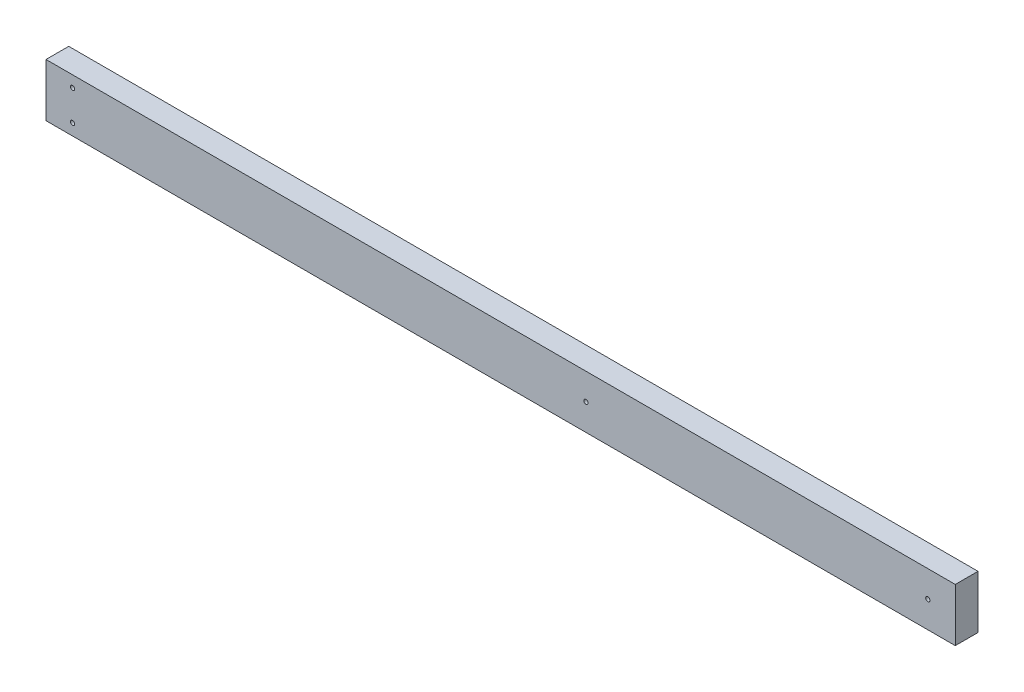
ISO-10303-21;
HEADER;
FILE_DESCRIPTION(('STEP AP214'),'2;1');
FILE_NAME('part.step','',(''),(''),'','','');
FILE_SCHEMA(('AUTOMOTIVE_DESIGN { 1 0 10303 214 1 1 1 1 }'));
ENDSEC;
DATA;
#1=APPLICATION_CONTEXT('core data for automotive mechanical design processes');
#2=APPLICATION_PROTOCOL_DEFINITION('international standard','automotive_design',2000,#1);
#3=PRODUCT_CONTEXT('',#1,'mechanical');
#4=PRODUCT('Part','Part','',(#3));
#5=PRODUCT_RELATED_PRODUCT_CATEGORY('part','',(#4));
#6=PRODUCT_DEFINITION_FORMATION('','',#4);
#7=PRODUCT_DEFINITION_CONTEXT('part definition',#1,'design');
#8=PRODUCT_DEFINITION('design','',#6,#7);
#9=PRODUCT_DEFINITION_SHAPE('','',#8);
#10=(LENGTH_UNIT() NAMED_UNIT(*) SI_UNIT(.MILLI.,.METRE.));
#11=(NAMED_UNIT(*) PLANE_ANGLE_UNIT() SI_UNIT($,.RADIAN.));
#12=(NAMED_UNIT(*) SI_UNIT($,.STERADIAN.) SOLID_ANGLE_UNIT());
#13=UNCERTAINTY_MEASURE_WITH_UNIT(LENGTH_MEASURE(1.E-05),#10,'distance_accuracy_value','');
#14=(GEOMETRIC_REPRESENTATION_CONTEXT(3) GLOBAL_UNCERTAINTY_ASSIGNED_CONTEXT((#13)) GLOBAL_UNIT_ASSIGNED_CONTEXT((#10,
#11,#12)) REPRESENTATION_CONTEXT('',''));
#15=CARTESIAN_POINT('',(0.,0.,0.));
#16=DIRECTION('',(0.,0.,1.));
#17=DIRECTION('',(1.,0.,0.));
#18=AXIS2_PLACEMENT_3D('',#15,#16,#17);
#19=CARTESIAN_POINT('',(1524.,0.,0.));
#20=DIRECTION('',(0.,0.,-1.));
#21=DIRECTION('',(-1.,0.,0.));
#22=AXIS2_PLACEMENT_3D('',#19,#20,#21);
#23=PLANE('',#22);
#24=CARTESIAN_POINT('',(44.45,19.05,0.));
#25=DIRECTION('',(0.,0.,1.));
#26=DIRECTION('',(1.,0.,0.));
#27=AXIS2_PLACEMENT_3D('',#24,#25,#26);
#28=CIRCLE('',#27,3.57187499999996);
#29=CARTESIAN_POINT('',(48.021875,19.05,0.));
#30=VERTEX_POINT('',#29);
#31=EDGE_CURVE('E122',#30,#30,#28,.T.);
#32=ORIENTED_EDGE('',*,*,#31,.F.);
#33=EDGE_LOOP('',(#32));
#34=FACE_BOUND('',#33,.T.);
#35=CARTESIAN_POINT('',(904.875,44.45,0.));
#36=DIRECTION('',(0.,0.,1.));
#37=DIRECTION('',(1.,0.,0.));
#38=AXIS2_PLACEMENT_3D('',#35,#36,#37);
#39=CIRCLE('',#38,3.57187499999998);
#40=CARTESIAN_POINT('',(908.446875,44.45,0.));
#41=VERTEX_POINT('',#40);
#42=EDGE_CURVE('E123',#41,#41,#39,.T.);
#43=ORIENTED_EDGE('',*,*,#42,.F.);
#44=EDGE_LOOP('',(#43));
#45=FACE_BOUND('',#44,.T.);
#46=CARTESIAN_POINT('',(44.45,69.85,0.));
#47=DIRECTION('',(0.,0.,1.));
#48=DIRECTION('',(1.,0.,0.));
#49=AXIS2_PLACEMENT_3D('',#46,#47,#48);
#50=CIRCLE('',#49,3.571875);
#51=CARTESIAN_POINT('',(48.021875,69.85,0.));
#52=VERTEX_POINT('',#51);
#53=EDGE_CURVE('E109',#52,#52,#50,.T.);
#54=ORIENTED_EDGE('',*,*,#53,.F.);
#55=EDGE_LOOP('',(#54));
#56=FACE_BOUND('',#55,.T.);
#57=CARTESIAN_POINT('',(1477.9625,44.45,0.));
#58=DIRECTION('',(0.,0.,1.));
#59=DIRECTION('',(1.,0.,0.));
#60=AXIS2_PLACEMENT_3D('',#57,#58,#59);
#61=CIRCLE('',#60,3.57187499999998);
#62=CARTESIAN_POINT('',(1481.534375,44.45,0.));
#63=VERTEX_POINT('',#62);
#64=EDGE_CURVE('E116',#63,#63,#61,.T.);
#65=ORIENTED_EDGE('',*,*,#64,.F.);
#66=EDGE_LOOP('',(#65));
#67=FACE_BOUND('',#66,.T.);
#68=DIRECTION('',(0.,-1.,0.));
#69=VECTOR('',#68,1.);
#70=CARTESIAN_POINT('',(0.,0.,0.));
#71=LINE('',#70,#69);
#72=CARTESIAN_POINT('',(0.,88.9,0.));
#73=VERTEX_POINT('',#72);
#74=CARTESIAN_POINT('',(0.,0.,0.));
#75=VERTEX_POINT('',#74);
#76=EDGE_CURVE('E95',#73,#75,#71,.T.);
#77=ORIENTED_EDGE('',*,*,#76,.T.);
#78=DIRECTION('',(-1.,0.,0.));
#79=VECTOR('',#78,1.);
#80=CARTESIAN_POINT('',(1524.,0.,0.));
#81=LINE('',#80,#79);
#82=CARTESIAN_POINT('',(1524.,0.,0.));
#83=VERTEX_POINT('',#82);
#84=EDGE_CURVE('E11',#83,#75,#81,.T.);
#85=ORIENTED_EDGE('',*,*,#84,.F.);
#86=DIRECTION('',(0.,-1.,0.));
#87=VECTOR('',#86,1.);
#88=CARTESIAN_POINT('',(1524.,0.,0.));
#89=LINE('',#88,#87);
#90=CARTESIAN_POINT('',(1524.,88.9,0.));
#91=VERTEX_POINT('',#90);
#92=EDGE_CURVE('E83',#91,#83,#89,.T.);
#93=ORIENTED_EDGE('',*,*,#92,.F.);
#94=DIRECTION('',(-1.,0.,0.));
#95=VECTOR('',#94,1.);
#96=CARTESIAN_POINT('',(1524.,88.9,0.));
#97=LINE('',#96,#95);
#98=EDGE_CURVE('E91',#91,#73,#97,.T.);
#99=ORIENTED_EDGE('',*,*,#98,.T.);
#100=EDGE_LOOP('',(#77,#85,#93,#99));
#101=FACE_BOUND('',#100,.T.);
#102=ADVANCED_FACE('F32',(#34,#45,#56,#67,#101),#23,.F.);
#103=CARTESIAN_POINT('',(1524.,0.,0.));
#104=DIRECTION('',(0.,1.,0.));
#105=DIRECTION('',(0.,0.,1.));
#106=AXIS2_PLACEMENT_3D('',#103,#104,#105);
#107=PLANE('',#106);
#108=DIRECTION('',(0.,0.,-1.));
#109=VECTOR('',#108,1.);
#110=CARTESIAN_POINT('',(0.,0.,0.));
#111=LINE('',#110,#109);
#112=CARTESIAN_POINT('',(0.,0.,-38.1));
#113=VERTEX_POINT('',#112);
#114=EDGE_CURVE('E87',#75,#113,#111,.T.);
#115=ORIENTED_EDGE('',*,*,#114,.T.);
#116=DIRECTION('',(-1.,0.,0.));
#117=VECTOR('',#116,1.);
#118=CARTESIAN_POINT('',(1524.,0.,-38.1));
#119=LINE('',#118,#117);
#120=CARTESIAN_POINT('',(1524.,0.,-38.1));
#121=VERTEX_POINT('',#120);
#122=EDGE_CURVE('E40',#121,#113,#119,.T.);
#123=ORIENTED_EDGE('',*,*,#122,.F.);
#124=DIRECTION('',(0.,0.,-1.));
#125=VECTOR('',#124,1.);
#126=CARTESIAN_POINT('',(1524.,0.,0.));
#127=LINE('',#126,#125);
#128=EDGE_CURVE('E78',#83,#121,#127,.T.);
#129=ORIENTED_EDGE('',*,*,#128,.F.);
#130=ORIENTED_EDGE('',*,*,#84,.T.);
#131=EDGE_LOOP('',(#115,#123,#129,#130));
#132=FACE_BOUND('',#131,.T.);
#133=ADVANCED_FACE('F86',(#132),#107,.F.);
#134=CARTESIAN_POINT('',(1524.,0.,-38.1));
#135=DIRECTION('',(0.,0.,1.));
#136=DIRECTION('',(1.,0.,0.));
#137=AXIS2_PLACEMENT_3D('',#134,#135,#136);
#138=PLANE('',#137);
#139=CARTESIAN_POINT('',(44.45,19.05,-38.1));
#140=DIRECTION('',(0.,0.,1.));
#141=DIRECTION('',(1.,0.,0.));
#142=AXIS2_PLACEMENT_3D('',#139,#140,#141);
#143=CIRCLE('',#142,3.57187499999996);
#144=CARTESIAN_POINT('',(48.021875,19.05,-38.1));
#145=VERTEX_POINT('',#144);
#146=EDGE_CURVE('E98',#145,#145,#143,.T.);
#147=ORIENTED_EDGE('',*,*,#146,.T.);
#148=EDGE_LOOP('',(#147));
#149=FACE_BOUND('',#148,.T.);
#150=CARTESIAN_POINT('',(904.875,44.45,-38.1));
#151=DIRECTION('',(0.,0.,1.));
#152=DIRECTION('',(1.,0.,0.));
#153=AXIS2_PLACEMENT_3D('',#150,#151,#152);
#154=CIRCLE('',#153,3.57187499999998);
#155=CARTESIAN_POINT('',(908.446875,44.45,-38.1));
#156=VERTEX_POINT('',#155);
#157=EDGE_CURVE('E113',#156,#156,#154,.T.);
#158=ORIENTED_EDGE('',*,*,#157,.T.);
#159=EDGE_LOOP('',(#158));
#160=FACE_BOUND('',#159,.T.);
#161=CARTESIAN_POINT('',(44.45,69.85,-38.1));
#162=DIRECTION('',(0.,0.,1.));
#163=DIRECTION('',(1.,0.,0.));
#164=AXIS2_PLACEMENT_3D('',#161,#162,#163);
#165=CIRCLE('',#164,3.571875);
#166=CARTESIAN_POINT('',(48.021875,69.85,-38.1));
#167=VERTEX_POINT('',#166);
#168=EDGE_CURVE('E112',#167,#167,#165,.T.);
#169=ORIENTED_EDGE('',*,*,#168,.T.);
#170=EDGE_LOOP('',(#169));
#171=FACE_BOUND('',#170,.T.);
#172=CARTESIAN_POINT('',(1477.9625,44.45,-38.1));
#173=DIRECTION('',(0.,0.,1.));
#174=DIRECTION('',(1.,0.,0.));
#175=AXIS2_PLACEMENT_3D('',#172,#173,#174);
#176=CIRCLE('',#175,3.57187499999998);
#177=CARTESIAN_POINT('',(1481.534375,44.45,-38.1));
#178=VERTEX_POINT('',#177);
#179=EDGE_CURVE('E119',#178,#178,#176,.T.);
#180=ORIENTED_EDGE('',*,*,#179,.T.);
#181=EDGE_LOOP('',(#180));
#182=FACE_BOUND('',#181,.T.);
#183=DIRECTION('',(0.,1.,0.));
#184=VECTOR('',#183,1.);
#185=CARTESIAN_POINT('',(0.,0.,-38.1));
#186=LINE('',#185,#184);
#187=CARTESIAN_POINT('',(0.,88.9,-38.1));
#188=VERTEX_POINT('',#187);
#189=EDGE_CURVE('E65',#113,#188,#186,.T.);
#190=ORIENTED_EDGE('',*,*,#189,.T.);
#191=DIRECTION('',(-1.,0.,0.));
#192=VECTOR('',#191,1.);
#193=CARTESIAN_POINT('',(1524.,88.9,-38.1));
#194=LINE('',#193,#192);
#195=CARTESIAN_POINT('',(1524.,88.9,-38.1));
#196=VERTEX_POINT('',#195);
#197=EDGE_CURVE('E88',#196,#188,#194,.T.);
#198=ORIENTED_EDGE('',*,*,#197,.F.);
#199=DIRECTION('',(0.,1.,0.));
#200=VECTOR('',#199,1.);
#201=CARTESIAN_POINT('',(1524.,0.,-38.1));
#202=LINE('',#201,#200);
#203=EDGE_CURVE('E81',#121,#196,#202,.T.);
#204=ORIENTED_EDGE('',*,*,#203,.F.);
#205=ORIENTED_EDGE('',*,*,#122,.T.);
#206=EDGE_LOOP('',(#190,#198,#204,#205));
#207=FACE_BOUND('',#206,.T.);
#208=ADVANCED_FACE('F89',(#149,#160,#171,#182,#207),#138,.F.);
#209=CARTESIAN_POINT('',(1524.,88.9,0.));
#210=DIRECTION('',(0.,-1.,0.));
#211=DIRECTION('',(0.,0.,-1.));
#212=AXIS2_PLACEMENT_3D('',#209,#210,#211);
#213=PLANE('',#212);
#214=DIRECTION('',(0.,0.,1.));
#215=VECTOR('',#214,1.);
#216=CARTESIAN_POINT('',(0.,88.9,0.));
#217=LINE('',#216,#215);
#218=EDGE_CURVE('E71',#188,#73,#217,.T.);
#219=ORIENTED_EDGE('',*,*,#218,.T.);
#220=ORIENTED_EDGE('',*,*,#98,.F.);
#221=DIRECTION('',(0.,0.,1.));
#222=VECTOR('',#221,1.);
#223=CARTESIAN_POINT('',(1524.,88.9,0.));
#224=LINE('',#223,#222);
#225=EDGE_CURVE('E48',#196,#91,#224,.T.);
#226=ORIENTED_EDGE('',*,*,#225,.F.);
#227=ORIENTED_EDGE('',*,*,#197,.T.);
#228=EDGE_LOOP('',(#219,#220,#226,#227));
#229=FACE_BOUND('',#228,.T.);
#230=ADVANCED_FACE('F103',(#229),#213,.F.);
#231=CARTESIAN_POINT('',(1524.,0.,0.));
#232=DIRECTION('',(-1.,0.,0.));
#233=DIRECTION('',(0.,0.,1.));
#234=AXIS2_PLACEMENT_3D('',#231,#232,#233);
#235=PLANE('',#234);
#236=ORIENTED_EDGE('',*,*,#92,.T.);
#237=ORIENTED_EDGE('',*,*,#128,.T.);
#238=ORIENTED_EDGE('',*,*,#203,.T.);
#239=ORIENTED_EDGE('',*,*,#225,.T.);
#240=EDGE_LOOP('',(#236,#237,#238,#239));
#241=FACE_BOUND('',#240,.T.);
#242=ADVANCED_FACE('F79',(#241),#235,.F.);
#243=CARTESIAN_POINT('',(0.,0.,0.));
#244=DIRECTION('',(-1.,0.,0.));
#245=DIRECTION('',(0.,0.,1.));
#246=AXIS2_PLACEMENT_3D('',#243,#244,#245);
#247=PLANE('',#246);
#248=ORIENTED_EDGE('',*,*,#76,.F.);
#249=ORIENTED_EDGE('',*,*,#218,.F.);
#250=ORIENTED_EDGE('',*,*,#189,.F.);
#251=ORIENTED_EDGE('',*,*,#114,.F.);
#252=EDGE_LOOP('',(#248,#249,#250,#251));
#253=FACE_BOUND('',#252,.T.);
#254=ADVANCED_FACE('F106',(#253),#247,.T.);
#255=CARTESIAN_POINT('',(1477.9625,44.45,-38.1));
#256=DIRECTION('',(0.,0.,1.));
#257=DIRECTION('',(1.,0.,0.));
#258=AXIS2_PLACEMENT_3D('',#255,#256,#257);
#259=CYLINDRICAL_SURFACE('',#258,3.57187499999998);
#260=CARTESIAN_POINT('',(1481.534375,44.45,-38.1));
#261=CARTESIAN_POINT('',(1481.534375,44.45,-37.703125));
#262=CARTESIAN_POINT('',(1481.534375,44.45,-37.30625));
#263=CARTESIAN_POINT('',(1481.534375,44.45,-36.5125));
#264=CARTESIAN_POINT('',(1481.534375,44.45,-36.115625));
#265=CARTESIAN_POINT('',(1481.534375,44.45,-35.321875));
#266=CARTESIAN_POINT('',(1481.534375,44.45,-34.925));
#267=CARTESIAN_POINT('',(1481.534375,44.45,-34.13125));
#268=CARTESIAN_POINT('',(1481.534375,44.45,-33.734375));
#269=CARTESIAN_POINT('',(1481.534375,44.45,-32.940625));
#270=CARTESIAN_POINT('',(1481.534375,44.45,-32.54375));
#271=CARTESIAN_POINT('',(1481.534375,44.45,-31.75));
#272=CARTESIAN_POINT('',(1481.534375,44.45,-31.353125));
#273=CARTESIAN_POINT('',(1481.534375,44.45,-30.559375));
#274=CARTESIAN_POINT('',(1481.534375,44.45,-30.1625));
#275=CARTESIAN_POINT('',(1481.534375,44.45,-29.36875));
#276=CARTESIAN_POINT('',(1481.534375,44.45,-28.971875));
#277=CARTESIAN_POINT('',(1481.534375,44.45,-28.178125));
#278=CARTESIAN_POINT('',(1481.534375,44.45,-27.78125));
#279=CARTESIAN_POINT('',(1481.534375,44.45,-26.9875));
#280=CARTESIAN_POINT('',(1481.534375,44.45,-26.590625));
#281=CARTESIAN_POINT('',(1481.534375,44.45,-25.796875));
#282=CARTESIAN_POINT('',(1481.534375,44.45,-25.4));
#283=CARTESIAN_POINT('',(1481.534375,44.45,-24.60625));
#284=CARTESIAN_POINT('',(1481.534375,44.45,-24.209375));
#285=CARTESIAN_POINT('',(1481.534375,44.45,-23.415625));
#286=CARTESIAN_POINT('',(1481.534375,44.45,-23.01875));
#287=CARTESIAN_POINT('',(1481.534375,44.45,-22.225));
#288=CARTESIAN_POINT('',(1481.534375,44.45,-21.828125));
#289=CARTESIAN_POINT('',(1481.534375,44.45,-21.034375));
#290=CARTESIAN_POINT('',(1481.534375,44.45,-20.6375));
#291=CARTESIAN_POINT('',(1481.534375,44.45,-19.84375));
#292=CARTESIAN_POINT('',(1481.534375,44.45,-19.446875));
#293=CARTESIAN_POINT('',(1481.534375,44.45,-18.653125));
#294=CARTESIAN_POINT('',(1481.534375,44.45,-18.25625));
#295=CARTESIAN_POINT('',(1481.534375,44.45,-17.4625));
#296=CARTESIAN_POINT('',(1481.534375,44.45,-17.065625));
#297=CARTESIAN_POINT('',(1481.534375,44.45,-16.271875));
#298=CARTESIAN_POINT('',(1481.534375,44.45,-15.875));
#299=CARTESIAN_POINT('',(1481.534375,44.45,-15.08125));
#300=CARTESIAN_POINT('',(1481.534375,44.45,-14.684375));
#301=CARTESIAN_POINT('',(1481.534375,44.45,-13.890625));
#302=CARTESIAN_POINT('',(1481.534375,44.45,-13.49375));
#303=CARTESIAN_POINT('',(1481.534375,44.45,-12.7));
#304=CARTESIAN_POINT('',(1481.534375,44.45,-12.303125));
#305=CARTESIAN_POINT('',(1481.534375,44.45,-11.509375));
#306=CARTESIAN_POINT('',(1481.534375,44.45,-11.1125));
#307=CARTESIAN_POINT('',(1481.534375,44.45,-10.31875));
#308=CARTESIAN_POINT('',(1481.534375,44.45,-9.921875));
#309=CARTESIAN_POINT('',(1481.534375,44.45,-9.128125));
#310=CARTESIAN_POINT('',(1481.534375,44.45,-8.73125));
#311=CARTESIAN_POINT('',(1481.534375,44.45,-7.9375));
#312=CARTESIAN_POINT('',(1481.534375,44.45,-7.540625));
#313=CARTESIAN_POINT('',(1481.534375,44.45,-6.746875));
#314=CARTESIAN_POINT('',(1481.534375,44.45,-6.35));
#315=CARTESIAN_POINT('',(1481.534375,44.45,-5.55625));
#316=CARTESIAN_POINT('',(1481.534375,44.45,-5.159375));
#317=CARTESIAN_POINT('',(1481.534375,44.45,-4.365625));
#318=CARTESIAN_POINT('',(1481.534375,44.45,-3.96875));
#319=CARTESIAN_POINT('',(1481.534375,44.45,-3.175));
#320=CARTESIAN_POINT('',(1481.534375,44.45,-2.778125));
#321=CARTESIAN_POINT('',(1481.534375,44.45,-1.984375));
#322=CARTESIAN_POINT('',(1481.534375,44.45,-1.5875));
#323=CARTESIAN_POINT('',(1481.534375,44.45,-0.79375));
#324=CARTESIAN_POINT('',(1481.534375,44.45,-0.396875));
#325=CARTESIAN_POINT('',(1481.534375,44.45,0.));
#326=B_SPLINE_CURVE_WITH_KNOTS('',3,(#260,#261,#262,#263,#264,#265,#266,#267,#268,#269,#270,
#271,#272,#273,#274,#275,#276,#277,#278,#279,#280,#281,#282,#283,#284,#285,#286,#287,#288,#289,
#290,#291,#292,#293,#294,#295,#296,#297,#298,#299,#300,#301,#302,#303,#304,#305,#306,#307,#308,
#309,#310,#311,#312,#313,#314,#315,#316,#317,#318,#319,#320,#321,#322,#323,#324,#325),
.UNSPECIFIED.,.F.,.F.,(4,2,2,2,2,2,2,2,2,2,2,2,2,2,2,2,2,2,2,2,2,2,2,2,2,2,2,2,2,2,2,2,4),(0.,
1.19062499999999,2.38124999999999,3.571875,4.7625,5.953125,7.14375,8.334375,9.525,10.715625,
11.90625,13.096875,14.2875,15.478125,16.66875,17.859375,19.05,20.240625,21.43125,22.621875,
23.8125,25.003125,26.19375,27.384375,28.575,29.765625,30.95625,32.146875,33.3375,34.528125,
35.71875,36.909375,38.1),.UNSPECIFIED.);
#327=EDGE_CURVE('BSEAM150',#178,#63,#326,.T.);
#328=ORIENTED_EDGE('',*,*,#179,.F.);
#329=ORIENTED_EDGE('',*,*,#64,.T.);
#330=ORIENTED_EDGE('',*,*,#327,.T.);
#331=ORIENTED_EDGE('',*,*,#327,.F.);
#332=EDGE_LOOP('',(#328,#330,#329,#331));
#333=FACE_BOUND('',#332,.T.);
#334=ADVANCED_FACE('F150',(#333),#259,.F.);
#335=CARTESIAN_POINT('',(44.45,69.85,-38.1));
#336=DIRECTION('',(0.,0.,1.));
#337=DIRECTION('',(1.,0.,0.));
#338=AXIS2_PLACEMENT_3D('',#335,#336,#337);
#339=CYLINDRICAL_SURFACE('',#338,3.571875);
#340=CARTESIAN_POINT('',(48.021875,69.85,-38.1));
#341=CARTESIAN_POINT('',(48.021875,69.85,-37.703125));
#342=CARTESIAN_POINT('',(48.021875,69.85,-37.30625));
#343=CARTESIAN_POINT('',(48.021875,69.85,-36.5125));
#344=CARTESIAN_POINT('',(48.021875,69.85,-36.115625));
#345=CARTESIAN_POINT('',(48.021875,69.85,-35.321875));
#346=CARTESIAN_POINT('',(48.021875,69.85,-34.925));
#347=CARTESIAN_POINT('',(48.021875,69.85,-34.13125));
#348=CARTESIAN_POINT('',(48.021875,69.85,-33.734375));
#349=CARTESIAN_POINT('',(48.021875,69.85,-32.940625));
#350=CARTESIAN_POINT('',(48.021875,69.85,-32.54375));
#351=CARTESIAN_POINT('',(48.021875,69.85,-31.75));
#352=CARTESIAN_POINT('',(48.021875,69.85,-31.353125));
#353=CARTESIAN_POINT('',(48.021875,69.85,-30.559375));
#354=CARTESIAN_POINT('',(48.021875,69.85,-30.1625));
#355=CARTESIAN_POINT('',(48.021875,69.85,-29.36875));
#356=CARTESIAN_POINT('',(48.021875,69.85,-28.971875));
#357=CARTESIAN_POINT('',(48.021875,69.85,-28.178125));
#358=CARTESIAN_POINT('',(48.021875,69.85,-27.78125));
#359=CARTESIAN_POINT('',(48.021875,69.85,-26.9875));
#360=CARTESIAN_POINT('',(48.021875,69.85,-26.590625));
#361=CARTESIAN_POINT('',(48.021875,69.85,-25.796875));
#362=CARTESIAN_POINT('',(48.021875,69.85,-25.4));
#363=CARTESIAN_POINT('',(48.021875,69.85,-24.60625));
#364=CARTESIAN_POINT('',(48.021875,69.85,-24.209375));
#365=CARTESIAN_POINT('',(48.021875,69.85,-23.415625));
#366=CARTESIAN_POINT('',(48.021875,69.85,-23.01875));
#367=CARTESIAN_POINT('',(48.021875,69.85,-22.225));
#368=CARTESIAN_POINT('',(48.021875,69.85,-21.828125));
#369=CARTESIAN_POINT('',(48.021875,69.85,-21.034375));
#370=CARTESIAN_POINT('',(48.021875,69.85,-20.6375));
#371=CARTESIAN_POINT('',(48.021875,69.85,-19.84375));
#372=CARTESIAN_POINT('',(48.021875,69.85,-19.446875));
#373=CARTESIAN_POINT('',(48.021875,69.85,-18.653125));
#374=CARTESIAN_POINT('',(48.021875,69.85,-18.25625));
#375=CARTESIAN_POINT('',(48.021875,69.85,-17.4625));
#376=CARTESIAN_POINT('',(48.021875,69.85,-17.065625));
#377=CARTESIAN_POINT('',(48.021875,69.85,-16.271875));
#378=CARTESIAN_POINT('',(48.021875,69.85,-15.875));
#379=CARTESIAN_POINT('',(48.021875,69.85,-15.08125));
#380=CARTESIAN_POINT('',(48.021875,69.85,-14.684375));
#381=CARTESIAN_POINT('',(48.021875,69.85,-13.890625));
#382=CARTESIAN_POINT('',(48.021875,69.85,-13.49375));
#383=CARTESIAN_POINT('',(48.021875,69.85,-12.7));
#384=CARTESIAN_POINT('',(48.021875,69.85,-12.303125));
#385=CARTESIAN_POINT('',(48.021875,69.85,-11.509375));
#386=CARTESIAN_POINT('',(48.021875,69.85,-11.1125));
#387=CARTESIAN_POINT('',(48.021875,69.85,-10.31875));
#388=CARTESIAN_POINT('',(48.021875,69.85,-9.921875));
#389=CARTESIAN_POINT('',(48.021875,69.85,-9.128125));
#390=CARTESIAN_POINT('',(48.021875,69.85,-8.73125));
#391=CARTESIAN_POINT('',(48.021875,69.85,-7.9375));
#392=CARTESIAN_POINT('',(48.021875,69.85,-7.540625));
#393=CARTESIAN_POINT('',(48.021875,69.85,-6.746875));
#394=CARTESIAN_POINT('',(48.021875,69.85,-6.35));
#395=CARTESIAN_POINT('',(48.021875,69.85,-5.55625));
#396=CARTESIAN_POINT('',(48.021875,69.85,-5.159375));
#397=CARTESIAN_POINT('',(48.021875,69.85,-4.365625));
#398=CARTESIAN_POINT('',(48.021875,69.85,-3.96875));
#399=CARTESIAN_POINT('',(48.021875,69.85,-3.175));
#400=CARTESIAN_POINT('',(48.021875,69.85,-2.778125));
#401=CARTESIAN_POINT('',(48.021875,69.85,-1.984375));
#402=CARTESIAN_POINT('',(48.021875,69.85,-1.5875));
#403=CARTESIAN_POINT('',(48.021875,69.85,-0.79375));
#404=CARTESIAN_POINT('',(48.021875,69.85,-0.396875));
#405=CARTESIAN_POINT('',(48.021875,69.85,0.));
#406=B_SPLINE_CURVE_WITH_KNOTS('',3,(#340,#341,#342,#343,#344,#345,#346,#347,#348,#349,#350,
#351,#352,#353,#354,#355,#356,#357,#358,#359,#360,#361,#362,#363,#364,#365,#366,#367,#368,#369,
#370,#371,#372,#373,#374,#375,#376,#377,#378,#379,#380,#381,#382,#383,#384,#385,#386,#387,#388,
#389,#390,#391,#392,#393,#394,#395,#396,#397,#398,#399,#400,#401,#402,#403,#404,#405),
.UNSPECIFIED.,.F.,.F.,(4,2,2,2,2,2,2,2,2,2,2,2,2,2,2,2,2,2,2,2,2,2,2,2,2,2,2,2,2,2,2,2,4),(0.,
1.19062499999999,2.38124999999999,3.571875,4.7625,5.953125,7.14375,8.334375,9.525,10.715625,
11.90625,13.096875,14.2875,15.478125,16.66875,17.859375,19.05,20.240625,21.43125,22.621875,
23.8125,25.003125,26.19375,27.384375,28.575,29.765625,30.95625,32.146875,33.3375,34.528125,
35.71875,36.909375,38.1),.UNSPECIFIED.);
#407=EDGE_CURVE('BSEAM152',#167,#52,#406,.T.);
#408=ORIENTED_EDGE('',*,*,#168,.F.);
#409=ORIENTED_EDGE('',*,*,#53,.T.);
#410=ORIENTED_EDGE('',*,*,#407,.T.);
#411=ORIENTED_EDGE('',*,*,#407,.F.);
#412=EDGE_LOOP('',(#408,#410,#409,#411));
#413=FACE_BOUND('',#412,.T.);
#414=ADVANCED_FACE('F152',(#413),#339,.F.);
#415=CARTESIAN_POINT('',(904.875,44.45,-38.1));
#416=DIRECTION('',(0.,0.,1.));
#417=DIRECTION('',(1.,0.,0.));
#418=AXIS2_PLACEMENT_3D('',#415,#416,#417);
#419=CYLINDRICAL_SURFACE('',#418,3.57187499999998);
#420=CARTESIAN_POINT('',(908.446875,44.45,-38.1));
#421=CARTESIAN_POINT('',(908.446875,44.45,-37.703125));
#422=CARTESIAN_POINT('',(908.446875,44.45,-37.30625));
#423=CARTESIAN_POINT('',(908.446875,44.45,-36.5125));
#424=CARTESIAN_POINT('',(908.446875,44.45,-36.115625));
#425=CARTESIAN_POINT('',(908.446875,44.45,-35.321875));
#426=CARTESIAN_POINT('',(908.446875,44.45,-34.925));
#427=CARTESIAN_POINT('',(908.446875,44.45,-34.13125));
#428=CARTESIAN_POINT('',(908.446875,44.45,-33.734375));
#429=CARTESIAN_POINT('',(908.446875,44.45,-32.940625));
#430=CARTESIAN_POINT('',(908.446875,44.45,-32.54375));
#431=CARTESIAN_POINT('',(908.446875,44.45,-31.75));
#432=CARTESIAN_POINT('',(908.446875,44.45,-31.353125));
#433=CARTESIAN_POINT('',(908.446875,44.45,-30.559375));
#434=CARTESIAN_POINT('',(908.446875,44.45,-30.1625));
#435=CARTESIAN_POINT('',(908.446875,44.45,-29.36875));
#436=CARTESIAN_POINT('',(908.446875,44.45,-28.971875));
#437=CARTESIAN_POINT('',(908.446875,44.45,-28.178125));
#438=CARTESIAN_POINT('',(908.446875,44.45,-27.78125));
#439=CARTESIAN_POINT('',(908.446875,44.45,-26.9875));
#440=CARTESIAN_POINT('',(908.446875,44.45,-26.590625));
#441=CARTESIAN_POINT('',(908.446875,44.45,-25.796875));
#442=CARTESIAN_POINT('',(908.446875,44.45,-25.4));
#443=CARTESIAN_POINT('',(908.446875,44.45,-24.60625));
#444=CARTESIAN_POINT('',(908.446875,44.45,-24.209375));
#445=CARTESIAN_POINT('',(908.446875,44.45,-23.415625));
#446=CARTESIAN_POINT('',(908.446875,44.45,-23.01875));
#447=CARTESIAN_POINT('',(908.446875,44.45,-22.225));
#448=CARTESIAN_POINT('',(908.446875,44.45,-21.828125));
#449=CARTESIAN_POINT('',(908.446875,44.45,-21.034375));
#450=CARTESIAN_POINT('',(908.446875,44.45,-20.6375));
#451=CARTESIAN_POINT('',(908.446875,44.45,-19.84375));
#452=CARTESIAN_POINT('',(908.446875,44.45,-19.446875));
#453=CARTESIAN_POINT('',(908.446875,44.45,-18.653125));
#454=CARTESIAN_POINT('',(908.446875,44.45,-18.25625));
#455=CARTESIAN_POINT('',(908.446875,44.45,-17.4625));
#456=CARTESIAN_POINT('',(908.446875,44.45,-17.065625));
#457=CARTESIAN_POINT('',(908.446875,44.45,-16.271875));
#458=CARTESIAN_POINT('',(908.446875,44.45,-15.875));
#459=CARTESIAN_POINT('',(908.446875,44.45,-15.08125));
#460=CARTESIAN_POINT('',(908.446875,44.45,-14.684375));
#461=CARTESIAN_POINT('',(908.446875,44.45,-13.890625));
#462=CARTESIAN_POINT('',(908.446875,44.45,-13.49375));
#463=CARTESIAN_POINT('',(908.446875,44.45,-12.7));
#464=CARTESIAN_POINT('',(908.446875,44.45,-12.303125));
#465=CARTESIAN_POINT('',(908.446875,44.45,-11.509375));
#466=CARTESIAN_POINT('',(908.446875,44.45,-11.1125));
#467=CARTESIAN_POINT('',(908.446875,44.45,-10.31875));
#468=CARTESIAN_POINT('',(908.446875,44.45,-9.921875));
#469=CARTESIAN_POINT('',(908.446875,44.45,-9.128125));
#470=CARTESIAN_POINT('',(908.446875,44.45,-8.73125));
#471=CARTESIAN_POINT('',(908.446875,44.45,-7.9375));
#472=CARTESIAN_POINT('',(908.446875,44.45,-7.540625));
#473=CARTESIAN_POINT('',(908.446875,44.45,-6.746875));
#474=CARTESIAN_POINT('',(908.446875,44.45,-6.35));
#475=CARTESIAN_POINT('',(908.446875,44.45,-5.55625));
#476=CARTESIAN_POINT('',(908.446875,44.45,-5.159375));
#477=CARTESIAN_POINT('',(908.446875,44.45,-4.365625));
#478=CARTESIAN_POINT('',(908.446875,44.45,-3.96875));
#479=CARTESIAN_POINT('',(908.446875,44.45,-3.175));
#480=CARTESIAN_POINT('',(908.446875,44.45,-2.778125));
#481=CARTESIAN_POINT('',(908.446875,44.45,-1.984375));
#482=CARTESIAN_POINT('',(908.446875,44.45,-1.5875));
#483=CARTESIAN_POINT('',(908.446875,44.45,-0.79375));
#484=CARTESIAN_POINT('',(908.446875,44.45,-0.396875));
#485=CARTESIAN_POINT('',(908.446875,44.45,0.));
#486=B_SPLINE_CURVE_WITH_KNOTS('',3,(#420,#421,#422,#423,#424,#425,#426,#427,#428,#429,#430,
#431,#432,#433,#434,#435,#436,#437,#438,#439,#440,#441,#442,#443,#444,#445,#446,#447,#448,#449,
#450,#451,#452,#453,#454,#455,#456,#457,#458,#459,#460,#461,#462,#463,#464,#465,#466,#467,#468,
#469,#470,#471,#472,#473,#474,#475,#476,#477,#478,#479,#480,#481,#482,#483,#484,#485),
.UNSPECIFIED.,.F.,.F.,(4,2,2,2,2,2,2,2,2,2,2,2,2,2,2,2,2,2,2,2,2,2,2,2,2,2,2,2,2,2,2,2,4),(0.,
1.19062499999999,2.38124999999999,3.571875,4.7625,5.953125,7.14375,8.334375,9.525,10.715625,
11.90625,13.096875,14.2875,15.478125,16.66875,17.859375,19.05,20.240625,21.43125,22.621875,
23.8125,25.003125,26.19375,27.384375,28.575,29.765625,30.95625,32.146875,33.3375,34.528125,
35.71875,36.909375,38.1),.UNSPECIFIED.);
#487=EDGE_CURVE('BSEAM138',#156,#41,#486,.T.);
#488=ORIENTED_EDGE('',*,*,#157,.F.);
#489=ORIENTED_EDGE('',*,*,#42,.T.);
#490=ORIENTED_EDGE('',*,*,#487,.T.);
#491=ORIENTED_EDGE('',*,*,#487,.F.);
#492=EDGE_LOOP('',(#488,#490,#489,#491));
#493=FACE_BOUND('',#492,.T.);
#494=ADVANCED_FACE('F138',(#493),#419,.F.);
#495=CARTESIAN_POINT('',(44.45,19.05,-38.1));
#496=DIRECTION('',(0.,0.,1.));
#497=DIRECTION('',(1.,0.,0.));
#498=AXIS2_PLACEMENT_3D('',#495,#496,#497);
#499=CYLINDRICAL_SURFACE('',#498,3.57187499999996);
#500=CARTESIAN_POINT('',(48.021875,19.05,-38.1));
#501=CARTESIAN_POINT('',(48.021875,19.05,-37.703125));
#502=CARTESIAN_POINT('',(48.021875,19.05,-37.30625));
#503=CARTESIAN_POINT('',(48.021875,19.05,-36.5125));
#504=CARTESIAN_POINT('',(48.021875,19.05,-36.115625));
#505=CARTESIAN_POINT('',(48.021875,19.05,-35.321875));
#506=CARTESIAN_POINT('',(48.021875,19.05,-34.925));
#507=CARTESIAN_POINT('',(48.021875,19.05,-34.13125));
#508=CARTESIAN_POINT('',(48.021875,19.05,-33.734375));
#509=CARTESIAN_POINT('',(48.021875,19.05,-32.940625));
#510=CARTESIAN_POINT('',(48.021875,19.05,-32.54375));
#511=CARTESIAN_POINT('',(48.021875,19.05,-31.75));
#512=CARTESIAN_POINT('',(48.021875,19.05,-31.353125));
#513=CARTESIAN_POINT('',(48.021875,19.05,-30.559375));
#514=CARTESIAN_POINT('',(48.021875,19.05,-30.1625));
#515=CARTESIAN_POINT('',(48.021875,19.05,-29.36875));
#516=CARTESIAN_POINT('',(48.021875,19.05,-28.971875));
#517=CARTESIAN_POINT('',(48.021875,19.05,-28.178125));
#518=CARTESIAN_POINT('',(48.021875,19.05,-27.78125));
#519=CARTESIAN_POINT('',(48.021875,19.05,-26.9875));
#520=CARTESIAN_POINT('',(48.021875,19.05,-26.590625));
#521=CARTESIAN_POINT('',(48.021875,19.05,-25.796875));
#522=CARTESIAN_POINT('',(48.021875,19.05,-25.4));
#523=CARTESIAN_POINT('',(48.021875,19.05,-24.60625));
#524=CARTESIAN_POINT('',(48.021875,19.05,-24.209375));
#525=CARTESIAN_POINT('',(48.021875,19.05,-23.415625));
#526=CARTESIAN_POINT('',(48.021875,19.05,-23.01875));
#527=CARTESIAN_POINT('',(48.021875,19.05,-22.225));
#528=CARTESIAN_POINT('',(48.021875,19.05,-21.828125));
#529=CARTESIAN_POINT('',(48.021875,19.05,-21.034375));
#530=CARTESIAN_POINT('',(48.021875,19.05,-20.6375));
#531=CARTESIAN_POINT('',(48.021875,19.05,-19.84375));
#532=CARTESIAN_POINT('',(48.021875,19.05,-19.446875));
#533=CARTESIAN_POINT('',(48.021875,19.05,-18.653125));
#534=CARTESIAN_POINT('',(48.021875,19.05,-18.25625));
#535=CARTESIAN_POINT('',(48.021875,19.05,-17.4625));
#536=CARTESIAN_POINT('',(48.021875,19.05,-17.065625));
#537=CARTESIAN_POINT('',(48.021875,19.05,-16.271875));
#538=CARTESIAN_POINT('',(48.021875,19.05,-15.875));
#539=CARTESIAN_POINT('',(48.021875,19.05,-15.08125));
#540=CARTESIAN_POINT('',(48.021875,19.05,-14.684375));
#541=CARTESIAN_POINT('',(48.021875,19.05,-13.890625));
#542=CARTESIAN_POINT('',(48.021875,19.05,-13.49375));
#543=CARTESIAN_POINT('',(48.021875,19.05,-12.7));
#544=CARTESIAN_POINT('',(48.021875,19.05,-12.303125));
#545=CARTESIAN_POINT('',(48.021875,19.05,-11.509375));
#546=CARTESIAN_POINT('',(48.021875,19.05,-11.1125));
#547=CARTESIAN_POINT('',(48.021875,19.05,-10.31875));
#548=CARTESIAN_POINT('',(48.021875,19.05,-9.921875));
#549=CARTESIAN_POINT('',(48.021875,19.05,-9.128125));
#550=CARTESIAN_POINT('',(48.021875,19.05,-8.73125));
#551=CARTESIAN_POINT('',(48.021875,19.05,-7.9375));
#552=CARTESIAN_POINT('',(48.021875,19.05,-7.540625));
#553=CARTESIAN_POINT('',(48.021875,19.05,-6.746875));
#554=CARTESIAN_POINT('',(48.021875,19.05,-6.35));
#555=CARTESIAN_POINT('',(48.021875,19.05,-5.55625));
#556=CARTESIAN_POINT('',(48.021875,19.05,-5.159375));
#557=CARTESIAN_POINT('',(48.021875,19.05,-4.365625));
#558=CARTESIAN_POINT('',(48.021875,19.05,-3.96875));
#559=CARTESIAN_POINT('',(48.021875,19.05,-3.175));
#560=CARTESIAN_POINT('',(48.021875,19.05,-2.778125));
#561=CARTESIAN_POINT('',(48.021875,19.05,-1.984375));
#562=CARTESIAN_POINT('',(48.021875,19.05,-1.5875));
#563=CARTESIAN_POINT('',(48.021875,19.05,-0.79375));
#564=CARTESIAN_POINT('',(48.021875,19.05,-0.396875));
#565=CARTESIAN_POINT('',(48.021875,19.05,0.));
#566=B_SPLINE_CURVE_WITH_KNOTS('',3,(#500,#501,#502,#503,#504,#505,#506,#507,#508,#509,#510,
#511,#512,#513,#514,#515,#516,#517,#518,#519,#520,#521,#522,#523,#524,#525,#526,#527,#528,#529,
#530,#531,#532,#533,#534,#535,#536,#537,#538,#539,#540,#541,#542,#543,#544,#545,#546,#547,#548,
#549,#550,#551,#552,#553,#554,#555,#556,#557,#558,#559,#560,#561,#562,#563,#564,#565),
.UNSPECIFIED.,.F.,.F.,(4,2,2,2,2,2,2,2,2,2,2,2,2,2,2,2,2,2,2,2,2,2,2,2,2,2,2,2,2,2,2,2,4),(0.,
1.19062499999999,2.38124999999999,3.571875,4.7625,5.953125,7.14375,8.334375,9.525,10.715625,
11.90625,13.096875,14.2875,15.478125,16.66875,17.859375,19.05,20.240625,21.43125,22.621875,
23.8125,25.003125,26.19375,27.384375,28.575,29.765625,30.95625,32.146875,33.3375,34.528125,
35.71875,36.909375,38.1),.UNSPECIFIED.);
#567=EDGE_CURVE('BSEAM135',#145,#30,#566,.T.);
#568=ORIENTED_EDGE('',*,*,#146,.F.);
#569=ORIENTED_EDGE('',*,*,#31,.T.);
#570=ORIENTED_EDGE('',*,*,#567,.T.);
#571=ORIENTED_EDGE('',*,*,#567,.F.);
#572=EDGE_LOOP('',(#568,#570,#569,#571));
#573=FACE_BOUND('',#572,.T.);
#574=ADVANCED_FACE('F135',(#573),#499,.F.);
#575=CLOSED_SHELL('',(#102,#133,#208,#230,#242,#254,#334,#414,#494,#574));
#576=MANIFOLD_SOLID_BREP('B2',#575);
#577=ADVANCED_BREP_SHAPE_REPRESENTATION('',(#18,#576),#14);
#578=SHAPE_DEFINITION_REPRESENTATION(#9,#577);
ENDSEC;
END-ISO-10303-21;
